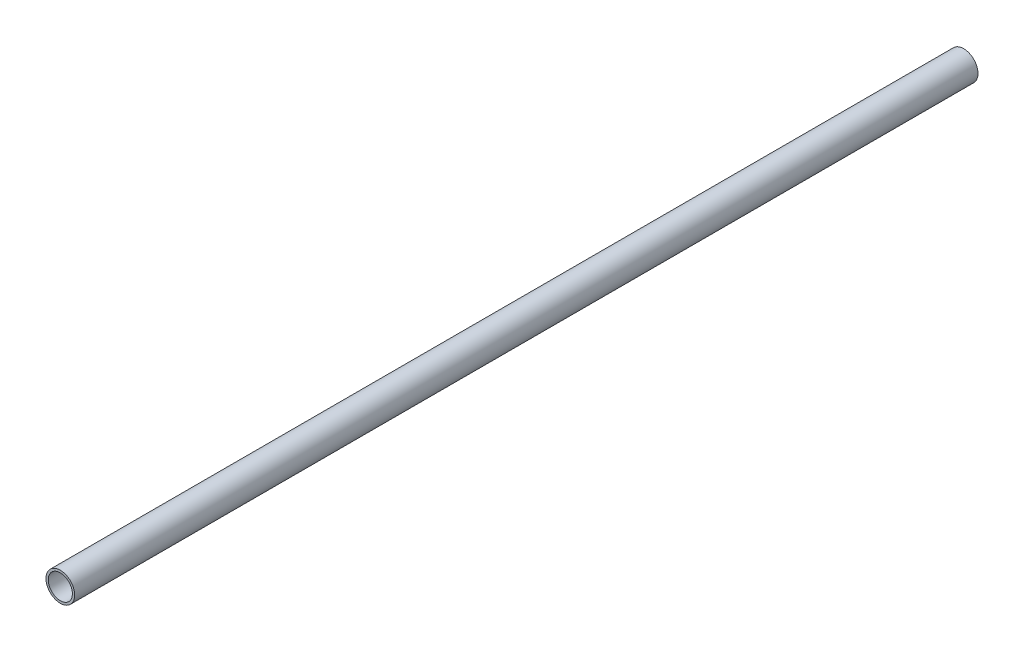
ISO-10303-21;
HEADER;
FILE_DESCRIPTION(('STEP AP214'),'2;1');
FILE_NAME('part.step','',(''),(''),'','','');
FILE_SCHEMA(('AUTOMOTIVE_DESIGN { 1 0 10303 214 1 1 1 1 }'));
ENDSEC;
DATA;
#1=APPLICATION_CONTEXT('core data for automotive mechanical design processes');
#2=APPLICATION_PROTOCOL_DEFINITION('international standard','automotive_design',2000,#1);
#3=PRODUCT_CONTEXT('',#1,'mechanical');
#4=PRODUCT('Part','Part','',(#3));
#5=PRODUCT_RELATED_PRODUCT_CATEGORY('part','',(#4));
#6=PRODUCT_DEFINITION_FORMATION('','',#4);
#7=PRODUCT_DEFINITION_CONTEXT('part definition',#1,'design');
#8=PRODUCT_DEFINITION('design','',#6,#7);
#9=PRODUCT_DEFINITION_SHAPE('','',#8);
#10=(LENGTH_UNIT() NAMED_UNIT(*) SI_UNIT(.MILLI.,.METRE.));
#11=(NAMED_UNIT(*) PLANE_ANGLE_UNIT() SI_UNIT($,.RADIAN.));
#12=(NAMED_UNIT(*) SI_UNIT($,.STERADIAN.) SOLID_ANGLE_UNIT());
#13=UNCERTAINTY_MEASURE_WITH_UNIT(LENGTH_MEASURE(1.E-05),#10,'distance_accuracy_value','');
#14=(GEOMETRIC_REPRESENTATION_CONTEXT(3) GLOBAL_UNCERTAINTY_ASSIGNED_CONTEXT((#13)) GLOBAL_UNIT_ASSIGNED_CONTEXT((#10,
#11,#12)) REPRESENTATION_CONTEXT('',''));
#15=CARTESIAN_POINT('',(0.,0.,0.));
#16=DIRECTION('',(0.,0.,1.));
#17=DIRECTION('',(1.,0.,0.));
#18=AXIS2_PLACEMENT_3D('',#15,#16,#17);
#19=CARTESIAN_POINT('',(0.,0.,400.));
#20=DIRECTION('',(0.,0.,1.));
#21=DIRECTION('',(1.,0.,0.));
#22=AXIS2_PLACEMENT_3D('',#19,#20,#21);
#23=PLANE('',#22);
#24=CARTESIAN_POINT('',(0.,0.,400.));
#25=DIRECTION('',(0.,0.,1.));
#26=DIRECTION('',(1.,0.,0.));
#27=AXIS2_PLACEMENT_3D('',#24,#25,#26);
#28=CIRCLE('',#27,6.35);
#29=CARTESIAN_POINT('',(6.35,0.,400.));
#30=VERTEX_POINT('',#29);
#31=EDGE_CURVE('E10',#30,#30,#28,.T.);
#32=ORIENTED_EDGE('',*,*,#31,.T.);
#33=EDGE_LOOP('',(#32));
#34=FACE_BOUND('',#33,.T.);
#35=CARTESIAN_POINT('',(0.,0.,400.));
#36=DIRECTION('',(0.,0.,1.));
#37=DIRECTION('',(1.,0.,0.));
#38=AXIS2_PLACEMENT_3D('',#35,#36,#37);
#39=CIRCLE('',#38,5.35);
#40=CARTESIAN_POINT('',(5.35,0.,400.));
#41=VERTEX_POINT('',#40);
#42=EDGE_CURVE('E50',#41,#41,#39,.T.);
#43=ORIENTED_EDGE('',*,*,#42,.F.);
#44=EDGE_LOOP('',(#43));
#45=FACE_BOUND('',#44,.T.);
#46=ADVANCED_FACE('F39',(#34,#45),#23,.T.);
#47=CARTESIAN_POINT('',(0.,0.,0.));
#48=DIRECTION('',(0.,0.,1.));
#49=DIRECTION('',(1.,0.,0.));
#50=AXIS2_PLACEMENT_3D('',#47,#48,#49);
#51=PLANE('',#50);
#52=CARTESIAN_POINT('',(0.,0.,0.));
#53=DIRECTION('',(0.,0.,1.));
#54=DIRECTION('',(1.,0.,0.));
#55=AXIS2_PLACEMENT_3D('',#52,#53,#54);
#56=CIRCLE('',#55,6.35);
#57=CARTESIAN_POINT('',(6.35,0.,0.));
#58=VERTEX_POINT('',#57);
#59=EDGE_CURVE('E43',#58,#58,#56,.T.);
#60=ORIENTED_EDGE('',*,*,#59,.F.);
#61=EDGE_LOOP('',(#60));
#62=FACE_BOUND('',#61,.T.);
#63=CARTESIAN_POINT('',(0.,0.,0.));
#64=DIRECTION('',(0.,0.,1.));
#65=DIRECTION('',(1.,0.,0.));
#66=AXIS2_PLACEMENT_3D('',#63,#64,#65);
#67=CIRCLE('',#66,5.35);
#68=CARTESIAN_POINT('',(5.35,0.,0.));
#69=VERTEX_POINT('',#68);
#70=EDGE_CURVE('E52',#69,#69,#67,.T.);
#71=ORIENTED_EDGE('',*,*,#70,.T.);
#72=EDGE_LOOP('',(#71));
#73=FACE_BOUND('',#72,.T.);
#74=ADVANCED_FACE('F62',(#62,#73),#51,.F.);
#75=CARTESIAN_POINT('',(0.,0.,400.));
#76=DIRECTION('',(0.,0.,-1.));
#77=DIRECTION('',(-1.,0.,0.));
#78=AXIS2_PLACEMENT_3D('',#75,#76,#77);
#79=CYLINDRICAL_SURFACE('',#78,6.35);
#80=ORIENTED_EDGE('',*,*,#31,.F.);
#81=EDGE_LOOP('',(#80));
#82=FACE_BOUND('',#81,.T.);
#83=ORIENTED_EDGE('',*,*,#59,.T.);
#84=EDGE_LOOP('',(#83));
#85=FACE_BOUND('',#84,.T.);
#86=ADVANCED_FACE('F41',(#82,#85),#79,.T.);
#87=CARTESIAN_POINT('',(0.,0.,400.));
#88=DIRECTION('',(0.,0.,-1.));
#89=DIRECTION('',(-1.,0.,0.));
#90=AXIS2_PLACEMENT_3D('',#87,#88,#89);
#91=CYLINDRICAL_SURFACE('',#90,5.35);
#92=ORIENTED_EDGE('',*,*,#42,.T.);
#93=EDGE_LOOP('',(#92));
#94=FACE_BOUND('',#93,.T.);
#95=ORIENTED_EDGE('',*,*,#70,.F.);
#96=EDGE_LOOP('',(#95));
#97=FACE_BOUND('',#96,.T.);
#98=ADVANCED_FACE('F58',(#94,#97),#91,.F.);
#99=CLOSED_SHELL('',(#46,#74,#86,#98));
#100=MANIFOLD_SOLID_BREP('B2',#99);
#101=ADVANCED_BREP_SHAPE_REPRESENTATION('',(#18,#100),#14);
#102=SHAPE_DEFINITION_REPRESENTATION(#9,#101);
ENDSEC;
END-ISO-10303-21;
